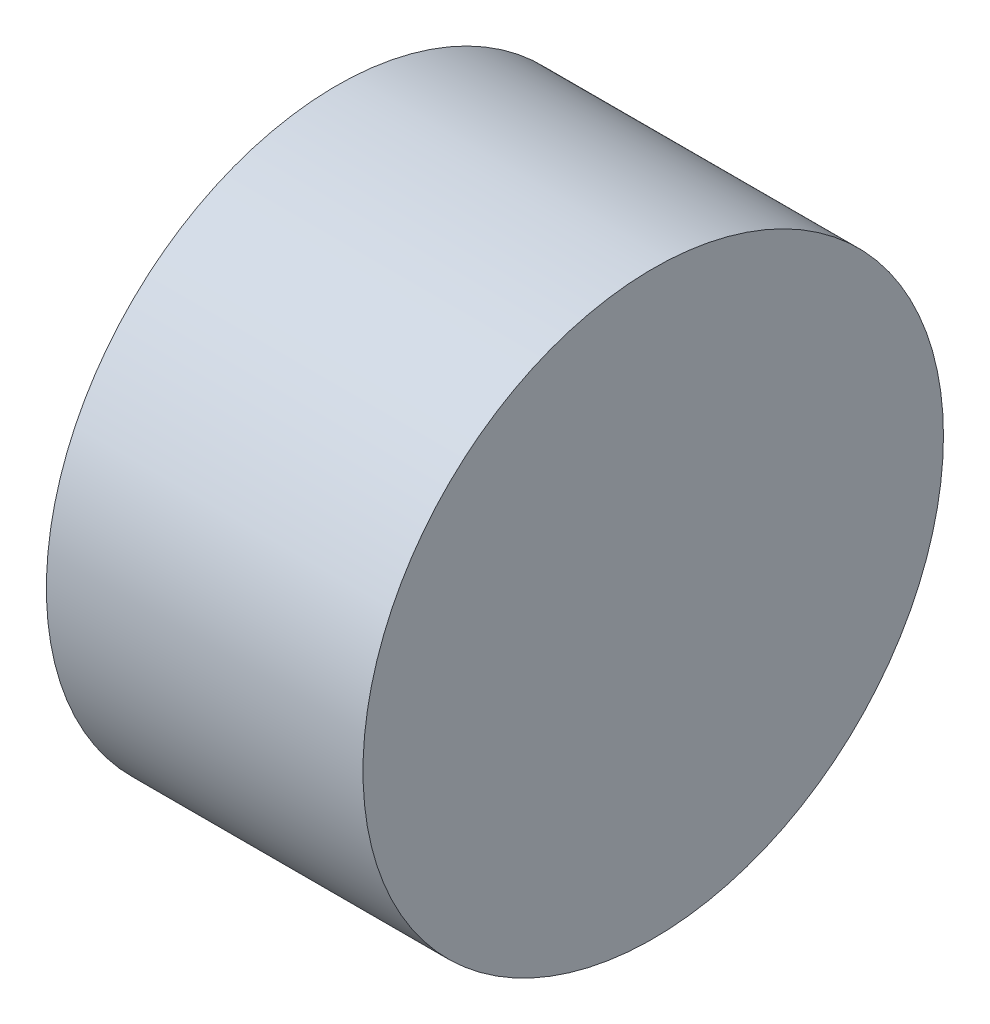
ISO-10303-21;
HEADER;
FILE_DESCRIPTION(('STEP AP214'),'2;1');
FILE_NAME('part.step','',(''),(''),'','','');
FILE_SCHEMA(('AUTOMOTIVE_DESIGN { 1 0 10303 214 1 1 1 1 }'));
ENDSEC;
DATA;
#1=APPLICATION_CONTEXT('core data for automotive mechanical design processes');
#2=APPLICATION_PROTOCOL_DEFINITION('international standard','automotive_design',2000,#1);
#3=PRODUCT_CONTEXT('',#1,'mechanical');
#4=PRODUCT('Part','Part','',(#3));
#5=PRODUCT_RELATED_PRODUCT_CATEGORY('part','',(#4));
#6=PRODUCT_DEFINITION_FORMATION('','',#4);
#7=PRODUCT_DEFINITION_CONTEXT('part definition',#1,'design');
#8=PRODUCT_DEFINITION('design','',#6,#7);
#9=PRODUCT_DEFINITION_SHAPE('','',#8);
#10=(LENGTH_UNIT() NAMED_UNIT(*) SI_UNIT(.MILLI.,.METRE.));
#11=(NAMED_UNIT(*) PLANE_ANGLE_UNIT() SI_UNIT($,.RADIAN.));
#12=(NAMED_UNIT(*) SI_UNIT($,.STERADIAN.) SOLID_ANGLE_UNIT());
#13=UNCERTAINTY_MEASURE_WITH_UNIT(LENGTH_MEASURE(1.E-05),#10,'distance_accuracy_value','');
#14=(GEOMETRIC_REPRESENTATION_CONTEXT(3) GLOBAL_UNCERTAINTY_ASSIGNED_CONTEXT((#13)) GLOBAL_UNIT_ASSIGNED_CONTEXT((#10,
#11,#12)) REPRESENTATION_CONTEXT('',''));
#15=CARTESIAN_POINT('',(0.,0.,0.));
#16=DIRECTION('',(0.,0.,1.));
#17=DIRECTION('',(1.,0.,0.));
#18=AXIS2_PLACEMENT_3D('',#15,#16,#17);
#19=CARTESIAN_POINT('',(30.,0.,0.));
#20=DIRECTION('',(-1.,0.,0.));
#21=DIRECTION('',(0.,0.,1.));
#22=AXIS2_PLACEMENT_3D('',#19,#20,#21);
#23=CYLINDRICAL_SURFACE('',#22,27.5);
#24=CARTESIAN_POINT('',(30.,0.,0.));
#25=DIRECTION('',(1.,0.,0.));
#26=DIRECTION('',(0.,0.,-1.));
#27=AXIS2_PLACEMENT_3D('',#24,#25,#26);
#28=CIRCLE('',#27,27.5);
#29=CARTESIAN_POINT('',(30.,0.,-27.5));
#30=VERTEX_POINT('',#29);
#31=EDGE_CURVE('E10',#30,#30,#28,.T.);
#32=ORIENTED_EDGE('',*,*,#31,.F.);
#33=EDGE_LOOP('',(#32));
#34=FACE_BOUND('',#33,.T.);
#35=CARTESIAN_POINT('',(0.,0.,0.));
#36=DIRECTION('',(1.,0.,0.));
#37=DIRECTION('',(0.,0.,-1.));
#38=AXIS2_PLACEMENT_3D('',#35,#36,#37);
#39=CIRCLE('',#38,27.5);
#40=CARTESIAN_POINT('',(0.,0.,-27.5));
#41=VERTEX_POINT('',#40);
#42=EDGE_CURVE('E37',#41,#41,#39,.T.);
#43=ORIENTED_EDGE('',*,*,#42,.T.);
#44=EDGE_LOOP('',(#43));
#45=FACE_BOUND('',#44,.T.);
#46=ADVANCED_FACE('F40',(#34,#45),#23,.T.);
#47=CARTESIAN_POINT('',(30.,0.,0.));
#48=DIRECTION('',(1.,0.,0.));
#49=DIRECTION('',(0.,0.,-1.));
#50=AXIS2_PLACEMENT_3D('',#47,#48,#49);
#51=PLANE('',#50);
#52=ORIENTED_EDGE('',*,*,#31,.T.);
#53=EDGE_LOOP('',(#52));
#54=FACE_BOUND('',#53,.T.);
#55=ADVANCED_FACE('F55',(#54),#51,.T.);
#56=CARTESIAN_POINT('',(0.,0.,0.));
#57=DIRECTION('',(1.,0.,0.));
#58=DIRECTION('',(0.,0.,-1.));
#59=AXIS2_PLACEMENT_3D('',#56,#57,#58);
#60=PLANE('',#59);
#61=ORIENTED_EDGE('',*,*,#42,.F.);
#62=EDGE_LOOP('',(#61));
#63=FACE_BOUND('',#62,.T.);
#64=ADVANCED_FACE('F49',(#63),#60,.F.);
#65=CLOSED_SHELL('',(#46,#55,#64));
#66=MANIFOLD_SOLID_BREP('B2',#65);
#67=ADVANCED_BREP_SHAPE_REPRESENTATION('',(#18,#66),#14);
#68=SHAPE_DEFINITION_REPRESENTATION(#9,#67);
ENDSEC;
END-ISO-10303-21;
